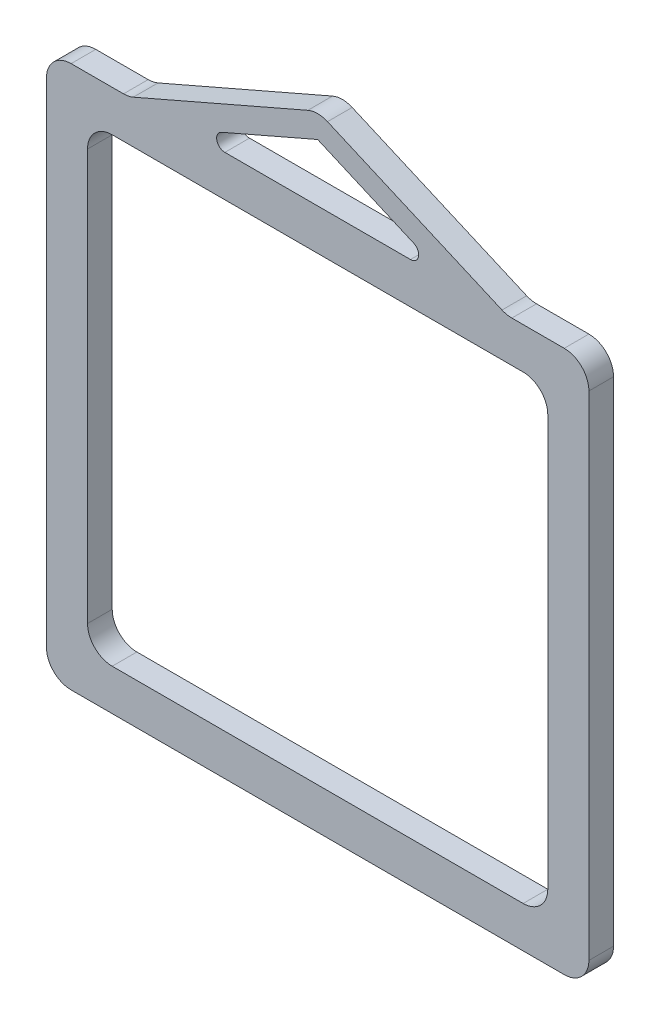
ISO-10303-21;
HEADER;
FILE_DESCRIPTION(('STEP AP214'),'2;1');
FILE_NAME('part.step','',(''),(''),'','','');
FILE_SCHEMA(('AUTOMOTIVE_DESIGN { 1 0 10303 214 1 1 1 1 }'));
ENDSEC;
DATA;
#1=APPLICATION_CONTEXT('core data for automotive mechanical design processes');
#2=APPLICATION_PROTOCOL_DEFINITION('international standard','automotive_design',2000,#1);
#3=PRODUCT_CONTEXT('',#1,'mechanical');
#4=PRODUCT('Part','Part','',(#3));
#5=PRODUCT_RELATED_PRODUCT_CATEGORY('part','',(#4));
#6=PRODUCT_DEFINITION_FORMATION('','',#4);
#7=PRODUCT_DEFINITION_CONTEXT('part definition',#1,'design');
#8=PRODUCT_DEFINITION('design','',#6,#7);
#9=PRODUCT_DEFINITION_SHAPE('','',#8);
#10=(LENGTH_UNIT() NAMED_UNIT(*) SI_UNIT(.MILLI.,.METRE.));
#11=(NAMED_UNIT(*) PLANE_ANGLE_UNIT() SI_UNIT($,.RADIAN.));
#12=(NAMED_UNIT(*) SI_UNIT($,.STERADIAN.) SOLID_ANGLE_UNIT());
#13=UNCERTAINTY_MEASURE_WITH_UNIT(LENGTH_MEASURE(1.E-05),#10,'distance_accuracy_value','');
#14=(GEOMETRIC_REPRESENTATION_CONTEXT(3) GLOBAL_UNCERTAINTY_ASSIGNED_CONTEXT((#13)) GLOBAL_UNIT_ASSIGNED_CONTEXT((#10,
#11,#12)) REPRESENTATION_CONTEXT('',''));
#15=CARTESIAN_POINT('',(0.,0.,0.));
#16=DIRECTION('',(0.,0.,1.));
#17=DIRECTION('',(1.,0.,0.));
#18=AXIS2_PLACEMENT_3D('',#15,#16,#17);
#19=CARTESIAN_POINT('',(33.,-33.,3.));
#20=DIRECTION('',(0.,0.,1.));
#21=DIRECTION('',(1.,0.,0.));
#22=AXIS2_PLACEMENT_3D('',#19,#20,#21);
#23=PLANE('',#22);
#24=DIRECTION('',(-1.,0.,0.));
#25=VECTOR('',#24,1.);
#26=CARTESIAN_POINT('',(-28.,28.,3.));
#27=LINE('',#26,#25);
#28=CARTESIAN_POINT('',(25.,28.,3.));
#29=VERTEX_POINT('',#28);
#30=CARTESIAN_POINT('',(-25.,28.,3.));
#31=VERTEX_POINT('',#30);
#32=EDGE_CURVE('E236',#29,#31,#27,.T.);
#33=ORIENTED_EDGE('',*,*,#32,.F.);
#34=CARTESIAN_POINT('',(25.,25.,3.));
#35=DIRECTION('',(0.,0.,1.));
#36=DIRECTION('',(1.,0.,0.));
#37=AXIS2_PLACEMENT_3D('',#34,#35,#36);
#38=CIRCLE('',#37,3.);
#39=CARTESIAN_POINT('',(28.,25.,3.));
#40=VERTEX_POINT('',#39);
#41=EDGE_CURVE('E387',#29,#40,#38,.F.);
#42=ORIENTED_EDGE('',*,*,#41,.T.);
#43=DIRECTION('',(0.,1.,0.));
#44=VECTOR('',#43,1.);
#45=CARTESIAN_POINT('',(28.,28.,3.));
#46=LINE('',#45,#44);
#47=CARTESIAN_POINT('',(28.,-25.,3.));
#48=VERTEX_POINT('',#47);
#49=EDGE_CURVE('E233',#48,#40,#46,.T.);
#50=ORIENTED_EDGE('',*,*,#49,.F.);
#51=CARTESIAN_POINT('',(25.,-25.,3.));
#52=DIRECTION('',(0.,0.,1.));
#53=DIRECTION('',(1.,0.,0.));
#54=AXIS2_PLACEMENT_3D('',#51,#52,#53);
#55=CIRCLE('',#54,3.);
#56=CARTESIAN_POINT('',(25.,-28.,3.));
#57=VERTEX_POINT('',#56);
#58=EDGE_CURVE('E383',#48,#57,#55,.F.);
#59=ORIENTED_EDGE('',*,*,#58,.T.);
#60=DIRECTION('',(1.,0.,0.));
#61=VECTOR('',#60,1.);
#62=CARTESIAN_POINT('',(-28.,-28.,3.));
#63=LINE('',#62,#61);
#64=CARTESIAN_POINT('',(-25.,-28.,3.));
#65=VERTEX_POINT('',#64);
#66=EDGE_CURVE('E243',#65,#57,#63,.T.);
#67=ORIENTED_EDGE('',*,*,#66,.F.);
#68=CARTESIAN_POINT('',(-25.,-25.,3.));
#69=DIRECTION('',(0.,0.,1.));
#70=DIRECTION('',(1.,0.,0.));
#71=AXIS2_PLACEMENT_3D('',#68,#69,#70);
#72=CIRCLE('',#71,3.);
#73=CARTESIAN_POINT('',(-28.,-25.,3.));
#74=VERTEX_POINT('',#73);
#75=EDGE_CURVE('E379',#65,#74,#72,.F.);
#76=ORIENTED_EDGE('',*,*,#75,.T.);
#77=DIRECTION('',(0.,-1.,0.));
#78=VECTOR('',#77,1.);
#79=CARTESIAN_POINT('',(-28.,28.,3.));
#80=LINE('',#79,#78);
#81=CARTESIAN_POINT('',(-28.,25.,3.));
#82=VERTEX_POINT('',#81);
#83=EDGE_CURVE('E240',#82,#74,#80,.T.);
#84=ORIENTED_EDGE('',*,*,#83,.F.);
#85=CARTESIAN_POINT('',(-25.,25.,3.));
#86=DIRECTION('',(0.,0.,1.));
#87=DIRECTION('',(1.,0.,0.));
#88=AXIS2_PLACEMENT_3D('',#85,#86,#87);
#89=CIRCLE('',#88,3.);
#90=EDGE_CURVE('E395',#82,#31,#89,.F.);
#91=ORIENTED_EDGE('',*,*,#90,.T.);
#92=EDGE_LOOP('',(#33,#42,#50,#59,#67,#76,#84,#91));
#93=FACE_BOUND('',#92,.T.);
#94=DIRECTION('',(1.,0.,0.));
#95=VECTOR('',#94,1.);
#96=CARTESIAN_POINT('',(-33.,-33.,3.));
#97=LINE('',#96,#95);
#98=CARTESIAN_POINT('',(-30.,-33.,3.));
#99=VERTEX_POINT('',#98);
#100=CARTESIAN_POINT('',(30.,-33.,3.));
#101=VERTEX_POINT('',#100);
#102=EDGE_CURVE('E276',#99,#101,#97,.T.);
#103=ORIENTED_EDGE('',*,*,#102,.T.);
#104=CARTESIAN_POINT('',(30.,-30.,3.));
#105=DIRECTION('',(0.,0.,1.));
#106=DIRECTION('',(1.,0.,0.));
#107=AXIS2_PLACEMENT_3D('',#104,#105,#106);
#108=CIRCLE('',#107,3.);
#109=CARTESIAN_POINT('',(33.,-30.,3.));
#110=VERTEX_POINT('',#109);
#111=EDGE_CURVE('E351',#101,#110,#108,.T.);
#112=ORIENTED_EDGE('',*,*,#111,.T.);
#113=DIRECTION('',(0.,1.,0.));
#114=VECTOR('',#113,1.);
#115=CARTESIAN_POINT('',(33.,33.,3.));
#116=LINE('',#115,#114);
#117=CARTESIAN_POINT('',(33.,30.,3.));
#118=VERTEX_POINT('',#117);
#119=EDGE_CURVE('E257',#110,#118,#116,.T.);
#120=ORIENTED_EDGE('',*,*,#119,.T.);
#121=CARTESIAN_POINT('',(30.,30.,3.));
#122=DIRECTION('',(0.,0.,1.));
#123=DIRECTION('',(1.,0.,0.));
#124=AXIS2_PLACEMENT_3D('',#121,#122,#123);
#125=CIRCLE('',#124,3.);
#126=CARTESIAN_POINT('',(30.,33.,3.));
#127=VERTEX_POINT('',#126);
#128=EDGE_CURVE('E345',#118,#127,#125,.T.);
#129=ORIENTED_EDGE('',*,*,#128,.T.);
#130=DIRECTION('',(-1.,0.,0.));
#131=VECTOR('',#130,1.);
#132=CARTESIAN_POINT('',(23.,33.,3.));
#133=LINE('',#132,#131);
#134=CARTESIAN_POINT('',(23.6239617223907,33.,3.));
#135=VERTEX_POINT('',#134);
#136=EDGE_CURVE('E260',#127,#135,#133,.T.);
#137=ORIENTED_EDGE('',*,*,#136,.T.);
#138=CARTESIAN_POINT('',(23.6239617223907,36.,3.));
#139=DIRECTION('',(0.,0.,1.));
#140=DIRECTION('',(1.,0.,0.));
#141=AXIS2_PLACEMENT_3D('',#138,#139,#140);
#142=CIRCLE('',#141,3.);
#143=CARTESIAN_POINT('',(22.4277833881473,33.2487898312403,3.));
#144=VERTEX_POINT('',#143);
#145=EDGE_CURVE('E391',#135,#144,#142,.F.);
#146=ORIENTED_EDGE('',*,*,#145,.T.);
#147=DIRECTION('',(-0.917070056253235,0.39872611141445,0.));
#148=VECTOR('',#147,1.);
#149=CARTESIAN_POINT('',(0.,43.,3.));
#150=LINE('',#149,#148);
#151=CARTESIAN_POINT('',(1.19617833424335,42.4799224633725,3.));
#152=VERTEX_POINT('',#151);
#153=EDGE_CURVE('E264',#144,#152,#150,.T.);
#154=ORIENTED_EDGE('',*,*,#153,.T.);
#155=CARTESIAN_POINT('',(0.,39.7287122946128,3.));
#156=DIRECTION('',(0.,0.,1.));
#157=DIRECTION('',(1.,0.,0.));
#158=AXIS2_PLACEMENT_3D('',#155,#156,#157);
#159=CIRCLE('',#158,3.);
#160=CARTESIAN_POINT('',(-1.19617833424335,42.4799224633725,3.));
#161=VERTEX_POINT('',#160);
#162=EDGE_CURVE('E347',#152,#161,#159,.T.);
#163=ORIENTED_EDGE('',*,*,#162,.T.);
#164=DIRECTION('',(-0.917070056253235,-0.398726111414451,0.));
#165=VECTOR('',#164,1.);
#166=CARTESIAN_POINT('',(-23.,33.,3.));
#167=LINE('',#166,#165);
#168=CARTESIAN_POINT('',(-22.4277833881473,33.2487898312403,3.));
#169=VERTEX_POINT('',#168);
#170=EDGE_CURVE('E267',#161,#169,#167,.T.);
#171=ORIENTED_EDGE('',*,*,#170,.T.);
#172=CARTESIAN_POINT('',(-23.6239617223906,36.,3.));
#173=DIRECTION('',(0.,0.,1.));
#174=DIRECTION('',(1.,0.,0.));
#175=AXIS2_PLACEMENT_3D('',#172,#173,#174);
#176=CIRCLE('',#175,3.);
#177=CARTESIAN_POINT('',(-23.6239617223906,33.,3.));
#178=VERTEX_POINT('',#177);
#179=EDGE_CURVE('E375',#169,#178,#176,.F.);
#180=ORIENTED_EDGE('',*,*,#179,.T.);
#181=DIRECTION('',(-1.,0.,0.));
#182=VECTOR('',#181,1.);
#183=CARTESIAN_POINT('',(-33.,33.,3.));
#184=LINE('',#183,#182);
#185=CARTESIAN_POINT('',(-30.,33.,3.));
#186=VERTEX_POINT('',#185);
#187=EDGE_CURVE('E270',#178,#186,#184,.T.);
#188=ORIENTED_EDGE('',*,*,#187,.T.);
#189=CARTESIAN_POINT('',(-30.,30.,3.));
#190=DIRECTION('',(0.,0.,1.));
#191=DIRECTION('',(1.,0.,0.));
#192=AXIS2_PLACEMENT_3D('',#189,#190,#191);
#193=CIRCLE('',#192,3.);
#194=CARTESIAN_POINT('',(-33.,30.,3.));
#195=VERTEX_POINT('',#194);
#196=EDGE_CURVE('E343',#186,#195,#193,.T.);
#197=ORIENTED_EDGE('',*,*,#196,.T.);
#198=DIRECTION('',(0.,-1.,0.));
#199=VECTOR('',#198,1.);
#200=CARTESIAN_POINT('',(-33.,33.,3.));
#201=LINE('',#200,#199);
#202=CARTESIAN_POINT('',(-33.,-30.,3.));
#203=VERTEX_POINT('',#202);
#204=EDGE_CURVE('E273',#195,#203,#201,.T.);
#205=ORIENTED_EDGE('',*,*,#204,.T.);
#206=CARTESIAN_POINT('',(-30.,-30.,3.));
#207=DIRECTION('',(0.,0.,1.));
#208=DIRECTION('',(1.,0.,0.));
#209=AXIS2_PLACEMENT_3D('',#206,#207,#208);
#210=CIRCLE('',#209,3.);
#211=EDGE_CURVE('E349',#203,#99,#210,.T.);
#212=ORIENTED_EDGE('',*,*,#211,.T.);
#213=EDGE_LOOP('',(#103,#112,#120,#129,#137,#146,#154,#163,#171,#180,#188,#197,#205,#212));
#214=FACE_BOUND('',#213,.T.);
#215=DIRECTION('',(-0.917070056253235,0.39872611141445,0.));
#216=VECTOR('',#215,1.);
#217=CARTESIAN_POINT('',(0.,40.,3.));
#218=LINE('',#217,#216);
#219=CARTESIAN_POINT('',(11.6907388706176,34.9170700562532,3.));
#220=VERTEX_POINT('',#219);
#221=CARTESIAN_POINT('',(0.,40.,3.));
#222=VERTEX_POINT('',#221);
#223=EDGE_CURVE('E216',#220,#222,#218,.T.);
#224=ORIENTED_EDGE('',*,*,#223,.F.);
#225=CARTESIAN_POINT('',(11.2920127592031,34.,3.));
#226=DIRECTION('',(0.,0.,1.));
#227=DIRECTION('',(1.,0.,0.));
#228=AXIS2_PLACEMENT_3D('',#225,#226,#227);
#229=CIRCLE('',#228,1.);
#230=CARTESIAN_POINT('',(11.2920127592031,33.,3.));
#231=VERTEX_POINT('',#230);
#232=EDGE_CURVE('E11',#220,#231,#229,.F.);
#233=ORIENTED_EDGE('',*,*,#232,.T.);
#234=DIRECTION('',(1.,0.,0.));
#235=VECTOR('',#234,1.);
#236=CARTESIAN_POINT('',(-16.1,33.,3.));
#237=LINE('',#236,#235);
#238=CARTESIAN_POINT('',(-11.2920127592031,33.,3.));
#239=VERTEX_POINT('',#238);
#240=EDGE_CURVE('E227',#239,#231,#237,.T.);
#241=ORIENTED_EDGE('',*,*,#240,.F.);
#242=CARTESIAN_POINT('',(-11.2920127592031,34.,3.));
#243=DIRECTION('',(0.,0.,1.));
#244=DIRECTION('',(1.,0.,0.));
#245=AXIS2_PLACEMENT_3D('',#242,#243,#244);
#246=CIRCLE('',#245,1.);
#247=CARTESIAN_POINT('',(-11.6907388706175,34.9170700562532,3.));
#248=VERTEX_POINT('',#247);
#249=EDGE_CURVE('E406',#239,#248,#246,.F.);
#250=ORIENTED_EDGE('',*,*,#249,.T.);
#251=DIRECTION('',(-0.917070056253235,-0.398726111414451,0.));
#252=VECTOR('',#251,1.);
#253=CARTESIAN_POINT('',(-16.1,33.,3.));
#254=LINE('',#253,#252);
#255=EDGE_CURVE('E221',#222,#248,#254,.T.);
#256=ORIENTED_EDGE('',*,*,#255,.F.);
#257=EDGE_LOOP('',(#224,#233,#241,#250,#256));
#258=FACE_BOUND('',#257,.T.);
#259=ADVANCED_FACE('F31',(#93,#214,#258),#23,.T.);
#260=CARTESIAN_POINT('',(33.,-33.,0.));
#261=DIRECTION('',(0.,0.,1.));
#262=DIRECTION('',(1.,0.,0.));
#263=AXIS2_PLACEMENT_3D('',#260,#261,#262);
#264=PLANE('',#263);
#265=DIRECTION('',(1.,0.,0.));
#266=VECTOR('',#265,1.);
#267=CARTESIAN_POINT('',(-28.,-28.,0.));
#268=LINE('',#267,#266);
#269=CARTESIAN_POINT('',(-25.,-28.,0.));
#270=VERTEX_POINT('',#269);
#271=CARTESIAN_POINT('',(25.,-28.,0.));
#272=VERTEX_POINT('',#271);
#273=EDGE_CURVE('E237',#270,#272,#268,.T.);
#274=ORIENTED_EDGE('',*,*,#273,.T.);
#275=CARTESIAN_POINT('',(25.,-25.,0.));
#276=DIRECTION('',(0.,0.,1.));
#277=DIRECTION('',(1.,0.,0.));
#278=AXIS2_PLACEMENT_3D('',#275,#276,#277);
#279=CIRCLE('',#278,3.);
#280=CARTESIAN_POINT('',(28.,-25.,0.));
#281=VERTEX_POINT('',#280);
#282=EDGE_CURVE('E381',#272,#281,#279,.T.);
#283=ORIENTED_EDGE('',*,*,#282,.T.);
#284=DIRECTION('',(0.,1.,0.));
#285=VECTOR('',#284,1.);
#286=CARTESIAN_POINT('',(28.,28.,0.));
#287=LINE('',#286,#285);
#288=CARTESIAN_POINT('',(28.,25.,0.));
#289=VERTEX_POINT('',#288);
#290=EDGE_CURVE('E220',#281,#289,#287,.T.);
#291=ORIENTED_EDGE('',*,*,#290,.T.);
#292=CARTESIAN_POINT('',(25.,25.,0.));
#293=DIRECTION('',(0.,0.,1.));
#294=DIRECTION('',(1.,0.,0.));
#295=AXIS2_PLACEMENT_3D('',#292,#293,#294);
#296=CIRCLE('',#295,3.);
#297=CARTESIAN_POINT('',(25.,28.,0.));
#298=VERTEX_POINT('',#297);
#299=EDGE_CURVE('E385',#289,#298,#296,.T.);
#300=ORIENTED_EDGE('',*,*,#299,.T.);
#301=DIRECTION('',(-1.,0.,0.));
#302=VECTOR('',#301,1.);
#303=CARTESIAN_POINT('',(-28.,28.,0.));
#304=LINE('',#303,#302);
#305=CARTESIAN_POINT('',(-25.,28.,0.));
#306=VERTEX_POINT('',#305);
#307=EDGE_CURVE('E249',#298,#306,#304,.T.);
#308=ORIENTED_EDGE('',*,*,#307,.T.);
#309=CARTESIAN_POINT('',(-25.,25.,0.));
#310=DIRECTION('',(0.,0.,1.));
#311=DIRECTION('',(1.,0.,0.));
#312=AXIS2_PLACEMENT_3D('',#309,#310,#311);
#313=CIRCLE('',#312,3.);
#314=CARTESIAN_POINT('',(-28.,25.,0.));
#315=VERTEX_POINT('',#314);
#316=EDGE_CURVE('E393',#306,#315,#313,.T.);
#317=ORIENTED_EDGE('',*,*,#316,.T.);
#318=DIRECTION('',(0.,-1.,0.));
#319=VECTOR('',#318,1.);
#320=CARTESIAN_POINT('',(-28.,28.,0.));
#321=LINE('',#320,#319);
#322=CARTESIAN_POINT('',(-28.,-25.,0.));
#323=VERTEX_POINT('',#322);
#324=EDGE_CURVE('E252',#315,#323,#321,.T.);
#325=ORIENTED_EDGE('',*,*,#324,.T.);
#326=CARTESIAN_POINT('',(-25.,-25.,0.));
#327=DIRECTION('',(0.,0.,1.));
#328=DIRECTION('',(1.,0.,0.));
#329=AXIS2_PLACEMENT_3D('',#326,#327,#328);
#330=CIRCLE('',#329,3.);
#331=EDGE_CURVE('E377',#323,#270,#330,.T.);
#332=ORIENTED_EDGE('',*,*,#331,.T.);
#333=EDGE_LOOP('',(#274,#283,#291,#300,#308,#317,#325,#332));
#334=FACE_BOUND('',#333,.T.);
#335=DIRECTION('',(0.,1.,0.));
#336=VECTOR('',#335,1.);
#337=CARTESIAN_POINT('',(33.,33.,0.));
#338=LINE('',#337,#336);
#339=CARTESIAN_POINT('',(33.,-30.,0.));
#340=VERTEX_POINT('',#339);
#341=CARTESIAN_POINT('',(33.,30.,0.));
#342=VERTEX_POINT('',#341);
#343=EDGE_CURVE('E246',#340,#342,#338,.T.);
#344=ORIENTED_EDGE('',*,*,#343,.F.);
#345=CARTESIAN_POINT('',(30.,-30.,0.));
#346=DIRECTION('',(0.,0.,1.));
#347=DIRECTION('',(1.,0.,0.));
#348=AXIS2_PLACEMENT_3D('',#345,#346,#347);
#349=CIRCLE('',#348,3.);
#350=CARTESIAN_POINT('',(30.,-33.,0.));
#351=VERTEX_POINT('',#350);
#352=EDGE_CURVE('E336',#340,#351,#349,.F.);
#353=ORIENTED_EDGE('',*,*,#352,.T.);
#354=DIRECTION('',(1.,0.,0.));
#355=VECTOR('',#354,1.);
#356=CARTESIAN_POINT('',(-33.,-33.,0.));
#357=LINE('',#356,#355);
#358=CARTESIAN_POINT('',(-30.,-33.,0.));
#359=VERTEX_POINT('',#358);
#360=EDGE_CURVE('E261',#359,#351,#357,.T.);
#361=ORIENTED_EDGE('',*,*,#360,.F.);
#362=CARTESIAN_POINT('',(-30.,-30.,0.));
#363=DIRECTION('',(0.,0.,1.));
#364=DIRECTION('',(1.,0.,0.));
#365=AXIS2_PLACEMENT_3D('',#362,#363,#364);
#366=CIRCLE('',#365,3.);
#367=CARTESIAN_POINT('',(-33.,-30.,0.));
#368=VERTEX_POINT('',#367);
#369=EDGE_CURVE('E334',#359,#368,#366,.F.);
#370=ORIENTED_EDGE('',*,*,#369,.T.);
#371=DIRECTION('',(0.,-1.,0.));
#372=VECTOR('',#371,1.);
#373=CARTESIAN_POINT('',(-33.,33.,0.));
#374=LINE('',#373,#372);
#375=CARTESIAN_POINT('',(-33.,30.,0.));
#376=VERTEX_POINT('',#375);
#377=EDGE_CURVE('E294',#376,#368,#374,.T.);
#378=ORIENTED_EDGE('',*,*,#377,.F.);
#379=CARTESIAN_POINT('',(-30.,30.,0.));
#380=DIRECTION('',(0.,0.,1.));
#381=DIRECTION('',(1.,0.,0.));
#382=AXIS2_PLACEMENT_3D('',#379,#380,#381);
#383=CIRCLE('',#382,3.);
#384=CARTESIAN_POINT('',(-30.,33.,0.));
#385=VERTEX_POINT('',#384);
#386=EDGE_CURVE('E328',#376,#385,#383,.F.);
#387=ORIENTED_EDGE('',*,*,#386,.T.);
#388=DIRECTION('',(-1.,0.,0.));
#389=VECTOR('',#388,1.);
#390=CARTESIAN_POINT('',(-33.,33.,0.));
#391=LINE('',#390,#389);
#392=CARTESIAN_POINT('',(-23.6239617223906,33.,0.));
#393=VERTEX_POINT('',#392);
#394=EDGE_CURVE('E291',#393,#385,#391,.T.);
#395=ORIENTED_EDGE('',*,*,#394,.F.);
#396=CARTESIAN_POINT('',(-23.6239617223906,36.,0.));
#397=DIRECTION('',(0.,0.,1.));
#398=DIRECTION('',(1.,0.,0.));
#399=AXIS2_PLACEMENT_3D('',#396,#397,#398);
#400=CIRCLE('',#399,3.);
#401=CARTESIAN_POINT('',(-22.4277833881473,33.2487898312403,0.));
#402=VERTEX_POINT('',#401);
#403=EDGE_CURVE('E373',#393,#402,#400,.T.);
#404=ORIENTED_EDGE('',*,*,#403,.T.);
#405=DIRECTION('',(-0.917070056253235,-0.398726111414451,0.));
#406=VECTOR('',#405,1.);
#407=CARTESIAN_POINT('',(-23.,33.,0.));
#408=LINE('',#407,#406);
#409=CARTESIAN_POINT('',(-1.19617833424335,42.4799224633725,0.));
#410=VERTEX_POINT('',#409);
#411=EDGE_CURVE('E288',#410,#402,#408,.T.);
#412=ORIENTED_EDGE('',*,*,#411,.F.);
#413=CARTESIAN_POINT('',(0.,39.7287122946128,0.));
#414=DIRECTION('',(0.,0.,1.));
#415=DIRECTION('',(1.,0.,0.));
#416=AXIS2_PLACEMENT_3D('',#413,#414,#415);
#417=CIRCLE('',#416,3.);
#418=CARTESIAN_POINT('',(1.19617833424335,42.4799224633725,0.));
#419=VERTEX_POINT('',#418);
#420=EDGE_CURVE('E332',#410,#419,#417,.F.);
#421=ORIENTED_EDGE('',*,*,#420,.T.);
#422=DIRECTION('',(-0.917070056253235,0.39872611141445,0.));
#423=VECTOR('',#422,1.);
#424=CARTESIAN_POINT('',(0.,43.,0.));
#425=LINE('',#424,#423);
#426=CARTESIAN_POINT('',(22.4277833881473,33.2487898312403,0.));
#427=VERTEX_POINT('',#426);
#428=EDGE_CURVE('E285',#427,#419,#425,.T.);
#429=ORIENTED_EDGE('',*,*,#428,.F.);
#430=CARTESIAN_POINT('',(23.6239617223907,36.,0.));
#431=DIRECTION('',(0.,0.,1.));
#432=DIRECTION('',(1.,0.,0.));
#433=AXIS2_PLACEMENT_3D('',#430,#431,#432);
#434=CIRCLE('',#433,3.);
#435=CARTESIAN_POINT('',(23.6239617223907,33.,0.));
#436=VERTEX_POINT('',#435);
#437=EDGE_CURVE('E389',#427,#436,#434,.T.);
#438=ORIENTED_EDGE('',*,*,#437,.T.);
#439=DIRECTION('',(-1.,0.,0.));
#440=VECTOR('',#439,1.);
#441=CARTESIAN_POINT('',(23.,33.,0.));
#442=LINE('',#441,#440);
#443=CARTESIAN_POINT('',(30.,33.,0.));
#444=VERTEX_POINT('',#443);
#445=EDGE_CURVE('E282',#444,#436,#442,.T.);
#446=ORIENTED_EDGE('',*,*,#445,.F.);
#447=CARTESIAN_POINT('',(30.,30.,0.));
#448=DIRECTION('',(0.,0.,1.));
#449=DIRECTION('',(1.,0.,0.));
#450=AXIS2_PLACEMENT_3D('',#447,#448,#449);
#451=CIRCLE('',#450,3.);
#452=EDGE_CURVE('E330',#444,#342,#451,.F.);
#453=ORIENTED_EDGE('',*,*,#452,.T.);
#454=EDGE_LOOP('',(#344,#353,#361,#370,#378,#387,#395,#404,#412,#421,#429,#438,#446,#453));
#455=FACE_BOUND('',#454,.T.);
#456=DIRECTION('',(-0.917070056253235,-0.398726111414451,0.));
#457=VECTOR('',#456,1.);
#458=CARTESIAN_POINT('',(-16.1,33.,0.));
#459=LINE('',#458,#457);
#460=CARTESIAN_POINT('',(0.,40.,0.));
#461=VERTEX_POINT('',#460);
#462=CARTESIAN_POINT('',(-11.6907388706175,34.9170700562532,0.));
#463=VERTEX_POINT('',#462);
#464=EDGE_CURVE('E210',#461,#463,#459,.T.);
#465=ORIENTED_EDGE('',*,*,#464,.T.);
#466=CARTESIAN_POINT('',(-11.2920127592031,34.,0.));
#467=DIRECTION('',(0.,0.,1.));
#468=DIRECTION('',(1.,0.,0.));
#469=AXIS2_PLACEMENT_3D('',#466,#467,#468);
#470=CIRCLE('',#469,1.);
#471=CARTESIAN_POINT('',(-11.2920127592031,33.,0.));
#472=VERTEX_POINT('',#471);
#473=EDGE_CURVE('E404',#463,#472,#470,.T.);
#474=ORIENTED_EDGE('',*,*,#473,.T.);
#475=DIRECTION('',(1.,0.,0.));
#476=VECTOR('',#475,1.);
#477=CARTESIAN_POINT('',(-16.1,33.,0.));
#478=LINE('',#477,#476);
#479=CARTESIAN_POINT('',(11.2920127592031,33.,0.));
#480=VERTEX_POINT('',#479);
#481=EDGE_CURVE('E211',#472,#480,#478,.T.);
#482=ORIENTED_EDGE('',*,*,#481,.T.);
#483=CARTESIAN_POINT('',(11.2920127592031,34.,0.));
#484=DIRECTION('',(0.,0.,1.));
#485=DIRECTION('',(1.,0.,0.));
#486=AXIS2_PLACEMENT_3D('',#483,#484,#485);
#487=CIRCLE('',#486,1.);
#488=CARTESIAN_POINT('',(11.6907388706176,34.9170700562532,0.));
#489=VERTEX_POINT('',#488);
#490=EDGE_CURVE('E39',#480,#489,#487,.T.);
#491=ORIENTED_EDGE('',*,*,#490,.T.);
#492=DIRECTION('',(-0.917070056253235,0.39872611141445,0.));
#493=VECTOR('',#492,1.);
#494=CARTESIAN_POINT('',(0.,40.,0.));
#495=LINE('',#494,#493);
#496=EDGE_CURVE('E206',#489,#461,#495,.T.);
#497=ORIENTED_EDGE('',*,*,#496,.T.);
#498=EDGE_LOOP('',(#465,#474,#482,#491,#497));
#499=FACE_BOUND('',#498,.T.);
#500=ADVANCED_FACE('F208',(#334,#455,#499),#264,.F.);
#501=CARTESIAN_POINT('',(33.,33.,3.));
#502=DIRECTION('',(-1.,0.,0.));
#503=DIRECTION('',(0.,0.,1.));
#504=AXIS2_PLACEMENT_3D('',#501,#502,#503);
#505=PLANE('',#504);
#506=ORIENTED_EDGE('',*,*,#119,.F.);
#507=DIRECTION('',(0.,0.,-1.));
#508=VECTOR('',#507,1.);
#509=CARTESIAN_POINT('',(33.,-30.,3.));
#510=LINE('',#509,#508);
#511=EDGE_CURVE('E325',#110,#340,#510,.T.);
#512=ORIENTED_EDGE('',*,*,#511,.T.);
#513=ORIENTED_EDGE('',*,*,#343,.T.);
#514=DIRECTION('',(0.,0.,-1.));
#515=VECTOR('',#514,1.);
#516=CARTESIAN_POINT('',(33.,30.,3.));
#517=LINE('',#516,#515);
#518=EDGE_CURVE('E323',#342,#118,#517,.F.);
#519=ORIENTED_EDGE('',*,*,#518,.T.);
#520=EDGE_LOOP('',(#506,#512,#513,#519));
#521=FACE_BOUND('',#520,.T.);
#522=ADVANCED_FACE('F432',(#521),#505,.F.);
#523=CARTESIAN_POINT('',(23.,33.,3.));
#524=DIRECTION('',(0.,-1.,0.));
#525=DIRECTION('',(0.,0.,-1.));
#526=AXIS2_PLACEMENT_3D('',#523,#524,#525);
#527=PLANE('',#526);
#528=ORIENTED_EDGE('',*,*,#445,.T.);
#529=DIRECTION('',(0.,0.,-1.));
#530=VECTOR('',#529,1.);
#531=CARTESIAN_POINT('',(23.6239617223907,33.,3.));
#532=LINE('',#531,#530);
#533=EDGE_CURVE('E371',#436,#135,#532,.F.);
#534=ORIENTED_EDGE('',*,*,#533,.T.);
#535=ORIENTED_EDGE('',*,*,#136,.F.);
#536=DIRECTION('',(0.,0.,-1.));
#537=VECTOR('',#536,1.);
#538=CARTESIAN_POINT('',(30.,33.,3.));
#539=LINE('',#538,#537);
#540=EDGE_CURVE('E368',#127,#444,#539,.T.);
#541=ORIENTED_EDGE('',*,*,#540,.T.);
#542=EDGE_LOOP('',(#528,#534,#535,#541));
#543=FACE_BOUND('',#542,.T.);
#544=ADVANCED_FACE('F460',(#543),#527,.F.);
#545=CARTESIAN_POINT('',(0.,43.,3.));
#546=DIRECTION('',(-0.39872611141445,-0.917070056253235,0.));
#547=DIRECTION('',(0.917070056253235,-0.39872611141445,0.));
#548=AXIS2_PLACEMENT_3D('',#545,#546,#547);
#549=PLANE('',#548);
#550=ORIENTED_EDGE('',*,*,#153,.F.);
#551=DIRECTION('',(0.,0.,-1.));
#552=VECTOR('',#551,1.);
#553=CARTESIAN_POINT('',(22.4277833881473,33.2487898312403,0.));
#554=LINE('',#553,#552);
#555=EDGE_CURVE('E365',#144,#427,#554,.T.);
#556=ORIENTED_EDGE('',*,*,#555,.T.);
#557=ORIENTED_EDGE('',*,*,#428,.T.);
#558=DIRECTION('',(0.,0.,-1.));
#559=VECTOR('',#558,1.);
#560=CARTESIAN_POINT('',(1.19617833424335,42.4799224633725,3.));
#561=LINE('',#560,#559);
#562=EDGE_CURVE('E363',#419,#152,#561,.F.);
#563=ORIENTED_EDGE('',*,*,#562,.T.);
#564=EDGE_LOOP('',(#550,#556,#557,#563));
#565=FACE_BOUND('',#564,.T.);
#566=ADVANCED_FACE('F456',(#565),#549,.F.);
#567=CARTESIAN_POINT('',(-23.,33.,3.));
#568=DIRECTION('',(0.398726111414451,-0.917070056253235,0.));
#569=DIRECTION('',(0.917070056253235,0.398726111414451,0.));
#570=AXIS2_PLACEMENT_3D('',#567,#568,#569);
#571=PLANE('',#570);
#572=ORIENTED_EDGE('',*,*,#411,.T.);
#573=DIRECTION('',(0.,0.,-1.));
#574=VECTOR('',#573,1.);
#575=CARTESIAN_POINT('',(-22.4277833881473,33.2487898312403,3.));
#576=LINE('',#575,#574);
#577=EDGE_CURVE('E306',#402,#169,#576,.F.);
#578=ORIENTED_EDGE('',*,*,#577,.T.);
#579=ORIENTED_EDGE('',*,*,#170,.F.);
#580=DIRECTION('',(0.,0.,-1.));
#581=VECTOR('',#580,1.);
#582=CARTESIAN_POINT('',(-1.19617833424335,42.4799224633725,3.));
#583=LINE('',#582,#581);
#584=EDGE_CURVE('E303',#161,#410,#583,.T.);
#585=ORIENTED_EDGE('',*,*,#584,.T.);
#586=EDGE_LOOP('',(#572,#578,#579,#585));
#587=FACE_BOUND('',#586,.T.);
#588=ADVANCED_FACE('F452',(#587),#571,.F.);
#589=CARTESIAN_POINT('',(-33.,33.,3.));
#590=DIRECTION('',(0.,-1.,0.));
#591=DIRECTION('',(0.,0.,-1.));
#592=AXIS2_PLACEMENT_3D('',#589,#590,#591);
#593=PLANE('',#592);
#594=ORIENTED_EDGE('',*,*,#187,.F.);
#595=DIRECTION('',(0.,0.,-1.));
#596=VECTOR('',#595,1.);
#597=CARTESIAN_POINT('',(-23.6239617223906,33.,0.));
#598=LINE('',#597,#596);
#599=EDGE_CURVE('E300',#178,#393,#598,.T.);
#600=ORIENTED_EDGE('',*,*,#599,.T.);
#601=ORIENTED_EDGE('',*,*,#394,.T.);
#602=DIRECTION('',(0.,0.,-1.));
#603=VECTOR('',#602,1.);
#604=CARTESIAN_POINT('',(-30.,33.,3.));
#605=LINE('',#604,#603);
#606=EDGE_CURVE('E279',#385,#186,#605,.F.);
#607=ORIENTED_EDGE('',*,*,#606,.T.);
#608=EDGE_LOOP('',(#594,#600,#601,#607));
#609=FACE_BOUND('',#608,.T.);
#610=ADVANCED_FACE('F448',(#609),#593,.F.);
#611=CARTESIAN_POINT('',(-33.,33.,3.));
#612=DIRECTION('',(1.,0.,0.));
#613=DIRECTION('',(0.,0.,-1.));
#614=AXIS2_PLACEMENT_3D('',#611,#612,#613);
#615=PLANE('',#614);
#616=ORIENTED_EDGE('',*,*,#377,.T.);
#617=DIRECTION('',(0.,0.,-1.));
#618=VECTOR('',#617,1.);
#619=CARTESIAN_POINT('',(-33.,-30.,3.));
#620=LINE('',#619,#618);
#621=EDGE_CURVE('E356',#368,#203,#620,.F.);
#622=ORIENTED_EDGE('',*,*,#621,.T.);
#623=ORIENTED_EDGE('',*,*,#204,.F.);
#624=DIRECTION('',(0.,0.,-1.));
#625=VECTOR('',#624,1.);
#626=CARTESIAN_POINT('',(-33.,30.,3.));
#627=LINE('',#626,#625);
#628=EDGE_CURVE('E353',#195,#376,#627,.T.);
#629=ORIENTED_EDGE('',*,*,#628,.T.);
#630=EDGE_LOOP('',(#616,#622,#623,#629));
#631=FACE_BOUND('',#630,.T.);
#632=ADVANCED_FACE('F444',(#631),#615,.F.);
#633=CARTESIAN_POINT('',(-33.,-33.,3.));
#634=DIRECTION('',(0.,1.,0.));
#635=DIRECTION('',(0.,0.,1.));
#636=AXIS2_PLACEMENT_3D('',#633,#634,#635);
#637=PLANE('',#636);
#638=ORIENTED_EDGE('',*,*,#360,.T.);
#639=DIRECTION('',(0.,0.,-1.));
#640=VECTOR('',#639,1.);
#641=CARTESIAN_POINT('',(30.,-33.,3.));
#642=LINE('',#641,#640);
#643=EDGE_CURVE('E341',#351,#101,#642,.F.);
#644=ORIENTED_EDGE('',*,*,#643,.T.);
#645=ORIENTED_EDGE('',*,*,#102,.F.);
#646=DIRECTION('',(0.,0.,-1.));
#647=VECTOR('',#646,1.);
#648=CARTESIAN_POINT('',(-30.,-33.,3.));
#649=LINE('',#648,#647);
#650=EDGE_CURVE('E338',#99,#359,#649,.T.);
#651=ORIENTED_EDGE('',*,*,#650,.T.);
#652=EDGE_LOOP('',(#638,#644,#645,#651));
#653=FACE_BOUND('',#652,.T.);
#654=ADVANCED_FACE('F441',(#653),#637,.F.);
#655=CARTESIAN_POINT('',(28.,28.,3.));
#656=DIRECTION('',(-1.,0.,0.));
#657=DIRECTION('',(0.,-1.,0.));
#658=AXIS2_PLACEMENT_3D('',#655,#656,#657);
#659=PLANE('',#658);
#660=ORIENTED_EDGE('',*,*,#290,.F.);
#661=DIRECTION('',(0.,0.,-1.));
#662=VECTOR('',#661,1.);
#663=CARTESIAN_POINT('',(28.,-25.,3.));
#664=LINE('',#663,#662);
#665=EDGE_CURVE('E321',#281,#48,#664,.F.);
#666=ORIENTED_EDGE('',*,*,#665,.T.);
#667=ORIENTED_EDGE('',*,*,#49,.T.);
#668=DIRECTION('',(0.,0.,-1.));
#669=VECTOR('',#668,1.);
#670=CARTESIAN_POINT('',(28.,25.,0.));
#671=LINE('',#670,#669);
#672=EDGE_CURVE('E318',#40,#289,#671,.T.);
#673=ORIENTED_EDGE('',*,*,#672,.T.);
#674=EDGE_LOOP('',(#660,#666,#667,#673));
#675=FACE_BOUND('',#674,.T.);
#676=ADVANCED_FACE('F438',(#675),#659,.T.);
#677=CARTESIAN_POINT('',(-28.,28.,3.));
#678=DIRECTION('',(0.,-1.,0.));
#679=DIRECTION('',(0.,0.,-1.));
#680=AXIS2_PLACEMENT_3D('',#677,#678,#679);
#681=PLANE('',#680);
#682=ORIENTED_EDGE('',*,*,#307,.F.);
#683=DIRECTION('',(0.,0.,-1.));
#684=VECTOR('',#683,1.);
#685=CARTESIAN_POINT('',(25.,28.,3.));
#686=LINE('',#685,#684);
#687=EDGE_CURVE('E361',#298,#29,#686,.F.);
#688=ORIENTED_EDGE('',*,*,#687,.T.);
#689=ORIENTED_EDGE('',*,*,#32,.T.);
#690=DIRECTION('',(0.,0.,-1.));
#691=VECTOR('',#690,1.);
#692=CARTESIAN_POINT('',(-25.,28.,0.));
#693=LINE('',#692,#691);
#694=EDGE_CURVE('E358',#31,#306,#693,.T.);
#695=ORIENTED_EDGE('',*,*,#694,.T.);
#696=EDGE_LOOP('',(#682,#688,#689,#695));
#697=FACE_BOUND('',#696,.T.);
#698=ADVANCED_FACE('F632',(#697),#681,.T.);
#699=CARTESIAN_POINT('',(-28.,28.,3.));
#700=DIRECTION('',(1.,0.,0.));
#701=DIRECTION('',(0.,1.,0.));
#702=AXIS2_PLACEMENT_3D('',#699,#700,#701);
#703=PLANE('',#702);
#704=ORIENTED_EDGE('',*,*,#83,.T.);
#705=DIRECTION('',(0.,0.,-1.));
#706=VECTOR('',#705,1.);
#707=CARTESIAN_POINT('',(-28.,-25.,0.));
#708=LINE('',#707,#706);
#709=EDGE_CURVE('E310',#74,#323,#708,.T.);
#710=ORIENTED_EDGE('',*,*,#709,.T.);
#711=ORIENTED_EDGE('',*,*,#324,.F.);
#712=DIRECTION('',(0.,0.,-1.));
#713=VECTOR('',#712,1.);
#714=CARTESIAN_POINT('',(-28.,25.,3.));
#715=LINE('',#714,#713);
#716=EDGE_CURVE('E308',#315,#82,#715,.F.);
#717=ORIENTED_EDGE('',*,*,#716,.T.);
#718=EDGE_LOOP('',(#704,#710,#711,#717));
#719=FACE_BOUND('',#718,.T.);
#720=ADVANCED_FACE('F639',(#719),#703,.T.);
#721=CARTESIAN_POINT('',(-28.,-28.,3.));
#722=DIRECTION('',(0.,1.,0.));
#723=DIRECTION('',(0.,0.,1.));
#724=AXIS2_PLACEMENT_3D('',#721,#722,#723);
#725=PLANE('',#724);
#726=ORIENTED_EDGE('',*,*,#273,.F.);
#727=DIRECTION('',(0.,0.,-1.));
#728=VECTOR('',#727,1.);
#729=CARTESIAN_POINT('',(-25.,-28.,3.));
#730=LINE('',#729,#728);
#731=EDGE_CURVE('E316',#270,#65,#730,.F.);
#732=ORIENTED_EDGE('',*,*,#731,.T.);
#733=ORIENTED_EDGE('',*,*,#66,.T.);
#734=DIRECTION('',(0.,0.,-1.));
#735=VECTOR('',#734,1.);
#736=CARTESIAN_POINT('',(25.,-28.,0.));
#737=LINE('',#736,#735);
#738=EDGE_CURVE('E313',#57,#272,#737,.T.);
#739=ORIENTED_EDGE('',*,*,#738,.T.);
#740=EDGE_LOOP('',(#726,#732,#733,#739));
#741=FACE_BOUND('',#740,.T.);
#742=ADVANCED_FACE('F584',(#741),#725,.T.);
#743=CARTESIAN_POINT('',(-16.1,33.,3.));
#744=DIRECTION('',(0.,1.,0.));
#745=DIRECTION('',(0.,0.,1.));
#746=AXIS2_PLACEMENT_3D('',#743,#744,#745);
#747=PLANE('',#746);
#748=ORIENTED_EDGE('',*,*,#481,.F.);
#749=DIRECTION('',(0.,0.,-1.));
#750=VECTOR('',#749,1.);
#751=CARTESIAN_POINT('',(-11.2920127592031,33.,3.));
#752=LINE('',#751,#750);
#753=EDGE_CURVE('E401',#472,#239,#752,.F.);
#754=ORIENTED_EDGE('',*,*,#753,.T.);
#755=ORIENTED_EDGE('',*,*,#240,.T.);
#756=DIRECTION('',(0.,0.,-1.));
#757=VECTOR('',#756,1.);
#758=CARTESIAN_POINT('',(11.2920127592031,33.,0.));
#759=LINE('',#758,#757);
#760=EDGE_CURVE('E398',#231,#480,#759,.T.);
#761=ORIENTED_EDGE('',*,*,#760,.T.);
#762=EDGE_LOOP('',(#748,#754,#755,#761));
#763=FACE_BOUND('',#762,.T.);
#764=ADVANCED_FACE('F416',(#763),#747,.T.);
#765=CARTESIAN_POINT('',(0.,40.,3.));
#766=DIRECTION('',(-0.39872611141445,-0.917070056253235,0.));
#767=DIRECTION('',(0.917070056253235,-0.39872611141445,0.));
#768=AXIS2_PLACEMENT_3D('',#765,#766,#767);
#769=PLANE('',#768);
#770=ORIENTED_EDGE('',*,*,#496,.F.);
#771=DIRECTION('',(0.,0.,-1.));
#772=VECTOR('',#771,1.);
#773=CARTESIAN_POINT('',(11.6907388706176,34.9170700562532,3.));
#774=LINE('',#773,#772);
#775=EDGE_CURVE('E46',#489,#220,#774,.F.);
#776=ORIENTED_EDGE('',*,*,#775,.T.);
#777=ORIENTED_EDGE('',*,*,#223,.T.);
#778=DIRECTION('',(0.,0.,-1.));
#779=VECTOR('',#778,1.);
#780=CARTESIAN_POINT('',(0.,40.,3.));
#781=LINE('',#780,#779);
#782=EDGE_CURVE('E214',#222,#461,#781,.T.);
#783=ORIENTED_EDGE('',*,*,#782,.T.);
#784=EDGE_LOOP('',(#770,#776,#777,#783));
#785=FACE_BOUND('',#784,.T.);
#786=ADVANCED_FACE('F215',(#785),#769,.T.);
#787=CARTESIAN_POINT('',(-16.1,33.,3.));
#788=DIRECTION('',(0.398726111414451,-0.917070056253235,0.));
#789=DIRECTION('',(0.917070056253235,0.398726111414451,0.));
#790=AXIS2_PLACEMENT_3D('',#787,#788,#789);
#791=PLANE('',#790);
#792=ORIENTED_EDGE('',*,*,#255,.T.);
#793=DIRECTION('',(0.,0.,-1.));
#794=VECTOR('',#793,1.);
#795=CARTESIAN_POINT('',(-11.6907388706175,34.9170700562532,0.));
#796=LINE('',#795,#794);
#797=EDGE_CURVE('E226',#248,#463,#796,.T.);
#798=ORIENTED_EDGE('',*,*,#797,.T.);
#799=ORIENTED_EDGE('',*,*,#464,.F.);
#800=ORIENTED_EDGE('',*,*,#782,.F.);
#801=EDGE_LOOP('',(#792,#798,#799,#800));
#802=FACE_BOUND('',#801,.T.);
#803=ADVANCED_FACE('F224',(#802),#791,.T.);
#804=CARTESIAN_POINT('',(-23.6239617223906,36.,3.));
#805=DIRECTION('',(0.,0.,1.));
#806=DIRECTION('',(1.,0.,0.));
#807=AXIS2_PLACEMENT_3D('',#804,#805,#806);
#808=CYLINDRICAL_SURFACE('',#807,3.);
#809=ORIENTED_EDGE('',*,*,#179,.F.);
#810=ORIENTED_EDGE('',*,*,#577,.F.);
#811=ORIENTED_EDGE('',*,*,#403,.F.);
#812=ORIENTED_EDGE('',*,*,#599,.F.);
#813=EDGE_LOOP('',(#809,#810,#811,#812));
#814=FACE_BOUND('',#813,.T.);
#815=ADVANCED_FACE('F468',(#814),#808,.F.);
#816=CARTESIAN_POINT('',(-25.,-25.,3.));
#817=DIRECTION('',(0.,0.,1.));
#818=DIRECTION('',(1.,0.,0.));
#819=AXIS2_PLACEMENT_3D('',#816,#817,#818);
#820=CYLINDRICAL_SURFACE('',#819,3.);
#821=ORIENTED_EDGE('',*,*,#75,.F.);
#822=ORIENTED_EDGE('',*,*,#731,.F.);
#823=ORIENTED_EDGE('',*,*,#331,.F.);
#824=ORIENTED_EDGE('',*,*,#709,.F.);
#825=EDGE_LOOP('',(#821,#822,#823,#824));
#826=FACE_BOUND('',#825,.T.);
#827=ADVANCED_FACE('F471',(#826),#820,.F.);
#828=CARTESIAN_POINT('',(25.,-25.,3.));
#829=DIRECTION('',(0.,0.,1.));
#830=DIRECTION('',(1.,0.,0.));
#831=AXIS2_PLACEMENT_3D('',#828,#829,#830);
#832=CYLINDRICAL_SURFACE('',#831,3.);
#833=ORIENTED_EDGE('',*,*,#58,.F.);
#834=ORIENTED_EDGE('',*,*,#665,.F.);
#835=ORIENTED_EDGE('',*,*,#282,.F.);
#836=ORIENTED_EDGE('',*,*,#738,.F.);
#837=EDGE_LOOP('',(#833,#834,#835,#836));
#838=FACE_BOUND('',#837,.T.);
#839=ADVANCED_FACE('F475',(#838),#832,.F.);
#840=CARTESIAN_POINT('',(30.,-30.,3.));
#841=DIRECTION('',(0.,0.,-1.));
#842=DIRECTION('',(-1.,0.,0.));
#843=AXIS2_PLACEMENT_3D('',#840,#841,#842);
#844=CYLINDRICAL_SURFACE('',#843,3.);
#845=ORIENTED_EDGE('',*,*,#111,.F.);
#846=ORIENTED_EDGE('',*,*,#643,.F.);
#847=ORIENTED_EDGE('',*,*,#352,.F.);
#848=ORIENTED_EDGE('',*,*,#511,.F.);
#849=EDGE_LOOP('',(#845,#846,#847,#848));
#850=FACE_BOUND('',#849,.T.);
#851=ADVANCED_FACE('F479',(#850),#844,.T.);
#852=CARTESIAN_POINT('',(-30.,-30.,3.));
#853=DIRECTION('',(0.,0.,-1.));
#854=DIRECTION('',(-1.,0.,0.));
#855=AXIS2_PLACEMENT_3D('',#852,#853,#854);
#856=CYLINDRICAL_SURFACE('',#855,3.);
#857=ORIENTED_EDGE('',*,*,#211,.F.);
#858=ORIENTED_EDGE('',*,*,#621,.F.);
#859=ORIENTED_EDGE('',*,*,#369,.F.);
#860=ORIENTED_EDGE('',*,*,#650,.F.);
#861=EDGE_LOOP('',(#857,#858,#859,#860));
#862=FACE_BOUND('',#861,.T.);
#863=ADVANCED_FACE('F483',(#862),#856,.T.);
#864=CARTESIAN_POINT('',(25.,25.,3.));
#865=DIRECTION('',(0.,0.,1.));
#866=DIRECTION('',(1.,0.,0.));
#867=AXIS2_PLACEMENT_3D('',#864,#865,#866);
#868=CYLINDRICAL_SURFACE('',#867,3.);
#869=ORIENTED_EDGE('',*,*,#41,.F.);
#870=ORIENTED_EDGE('',*,*,#687,.F.);
#871=ORIENTED_EDGE('',*,*,#299,.F.);
#872=ORIENTED_EDGE('',*,*,#672,.F.);
#873=EDGE_LOOP('',(#869,#870,#871,#872));
#874=FACE_BOUND('',#873,.T.);
#875=ADVANCED_FACE('F487',(#874),#868,.F.);
#876=CARTESIAN_POINT('',(23.6239617223907,36.,3.));
#877=DIRECTION('',(0.,0.,1.));
#878=DIRECTION('',(1.,0.,0.));
#879=AXIS2_PLACEMENT_3D('',#876,#877,#878);
#880=CYLINDRICAL_SURFACE('',#879,3.);
#881=ORIENTED_EDGE('',*,*,#145,.F.);
#882=ORIENTED_EDGE('',*,*,#533,.F.);
#883=ORIENTED_EDGE('',*,*,#437,.F.);
#884=ORIENTED_EDGE('',*,*,#555,.F.);
#885=EDGE_LOOP('',(#881,#882,#883,#884));
#886=FACE_BOUND('',#885,.T.);
#887=ADVANCED_FACE('F491',(#886),#880,.F.);
#888=CARTESIAN_POINT('',(0.,39.7287122946128,3.));
#889=DIRECTION('',(0.,0.,-1.));
#890=DIRECTION('',(-1.,0.,0.));
#891=AXIS2_PLACEMENT_3D('',#888,#889,#890);
#892=CYLINDRICAL_SURFACE('',#891,3.);
#893=ORIENTED_EDGE('',*,*,#162,.F.);
#894=ORIENTED_EDGE('',*,*,#562,.F.);
#895=ORIENTED_EDGE('',*,*,#420,.F.);
#896=ORIENTED_EDGE('',*,*,#584,.F.);
#897=EDGE_LOOP('',(#893,#894,#895,#896));
#898=FACE_BOUND('',#897,.T.);
#899=ADVANCED_FACE('F495',(#898),#892,.T.);
#900=CARTESIAN_POINT('',(30.,30.,3.));
#901=DIRECTION('',(0.,0.,-1.));
#902=DIRECTION('',(-1.,0.,0.));
#903=AXIS2_PLACEMENT_3D('',#900,#901,#902);
#904=CYLINDRICAL_SURFACE('',#903,3.);
#905=ORIENTED_EDGE('',*,*,#128,.F.);
#906=ORIENTED_EDGE('',*,*,#518,.F.);
#907=ORIENTED_EDGE('',*,*,#452,.F.);
#908=ORIENTED_EDGE('',*,*,#540,.F.);
#909=EDGE_LOOP('',(#905,#906,#907,#908));
#910=FACE_BOUND('',#909,.T.);
#911=ADVANCED_FACE('F499',(#910),#904,.T.);
#912=CARTESIAN_POINT('',(-25.,25.,3.));
#913=DIRECTION('',(0.,0.,1.));
#914=DIRECTION('',(1.,0.,0.));
#915=AXIS2_PLACEMENT_3D('',#912,#913,#914);
#916=CYLINDRICAL_SURFACE('',#915,3.);
#917=ORIENTED_EDGE('',*,*,#90,.F.);
#918=ORIENTED_EDGE('',*,*,#716,.F.);
#919=ORIENTED_EDGE('',*,*,#316,.F.);
#920=ORIENTED_EDGE('',*,*,#694,.F.);
#921=EDGE_LOOP('',(#917,#918,#919,#920));
#922=FACE_BOUND('',#921,.T.);
#923=ADVANCED_FACE('F503',(#922),#916,.F.);
#924=CARTESIAN_POINT('',(-30.,30.,3.));
#925=DIRECTION('',(0.,0.,-1.));
#926=DIRECTION('',(-1.,0.,0.));
#927=AXIS2_PLACEMENT_3D('',#924,#925,#926);
#928=CYLINDRICAL_SURFACE('',#927,3.);
#929=ORIENTED_EDGE('',*,*,#196,.F.);
#930=ORIENTED_EDGE('',*,*,#606,.F.);
#931=ORIENTED_EDGE('',*,*,#386,.F.);
#932=ORIENTED_EDGE('',*,*,#628,.F.);
#933=EDGE_LOOP('',(#929,#930,#931,#932));
#934=FACE_BOUND('',#933,.T.);
#935=ADVANCED_FACE('F425',(#934),#928,.T.);
#936=CARTESIAN_POINT('',(-11.2920127592031,34.,3.));
#937=DIRECTION('',(0.,0.,1.));
#938=DIRECTION('',(1.,0.,0.));
#939=AXIS2_PLACEMENT_3D('',#936,#937,#938);
#940=CYLINDRICAL_SURFACE('',#939,1.);
#941=ORIENTED_EDGE('',*,*,#249,.F.);
#942=ORIENTED_EDGE('',*,*,#753,.F.);
#943=ORIENTED_EDGE('',*,*,#473,.F.);
#944=ORIENTED_EDGE('',*,*,#797,.F.);
#945=EDGE_LOOP('',(#941,#942,#943,#944));
#946=FACE_BOUND('',#945,.T.);
#947=ADVANCED_FACE('F413',(#946),#940,.F.);
#948=CARTESIAN_POINT('',(11.2920127592031,34.,3.));
#949=DIRECTION('',(0.,0.,1.));
#950=DIRECTION('',(1.,0.,0.));
#951=AXIS2_PLACEMENT_3D('',#948,#949,#950);
#952=CYLINDRICAL_SURFACE('',#951,1.);
#953=ORIENTED_EDGE('',*,*,#232,.F.);
#954=ORIENTED_EDGE('',*,*,#775,.F.);
#955=ORIENTED_EDGE('',*,*,#490,.F.);
#956=ORIENTED_EDGE('',*,*,#760,.F.);
#957=EDGE_LOOP('',(#953,#954,#955,#956));
#958=FACE_BOUND('',#957,.T.);
#959=ADVANCED_FACE('F33',(#958),#952,.F.);
#960=CLOSED_SHELL('',(#259,#500,#522,#544,#566,#588,#610,#632,#654,#676,#698,#720,#742,#764,
#786,#803,#815,#827,#839,#851,#863,#875,#887,#899,#911,#923,#935,#947,#959));
#961=MANIFOLD_SOLID_BREP('B2',#960);
#962=ADVANCED_BREP_SHAPE_REPRESENTATION('',(#18,#961),#14);
#963=SHAPE_DEFINITION_REPRESENTATION(#9,#962);
ENDSEC;
END-ISO-10303-21;
